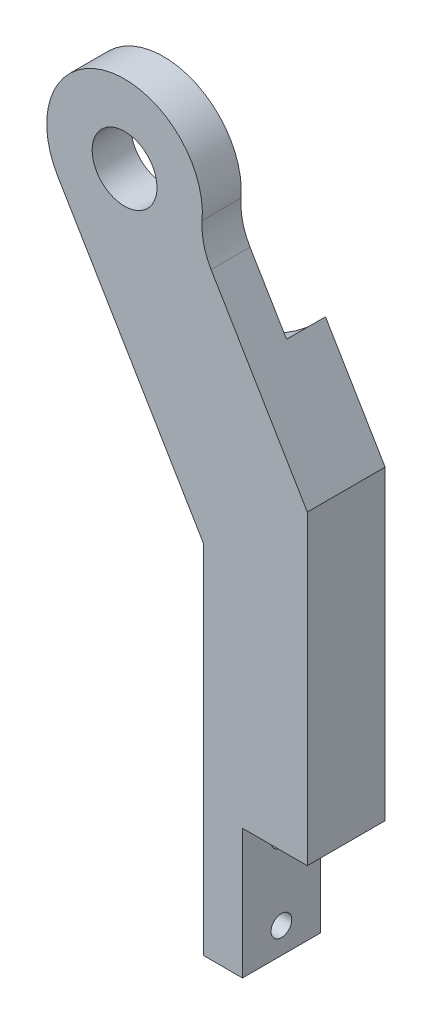
ISO-10303-21;
HEADER;
FILE_DESCRIPTION(('STEP AP214'),'2;1');
FILE_NAME('part.step','',(''),(''),'','','');
FILE_SCHEMA(('AUTOMOTIVE_DESIGN { 1 0 10303 214 1 1 1 1 }'));
ENDSEC;
DATA;
#1=APPLICATION_CONTEXT('core data for automotive mechanical design processes');
#2=APPLICATION_PROTOCOL_DEFINITION('international standard','automotive_design',2000,#1);
#3=PRODUCT_CONTEXT('',#1,'mechanical');
#4=PRODUCT('Part','Part','',(#3));
#5=PRODUCT_RELATED_PRODUCT_CATEGORY('part','',(#4));
#6=PRODUCT_DEFINITION_FORMATION('','',#4);
#7=PRODUCT_DEFINITION_CONTEXT('part definition',#1,'design');
#8=PRODUCT_DEFINITION('design','',#6,#7);
#9=PRODUCT_DEFINITION_SHAPE('','',#8);
#10=(LENGTH_UNIT() NAMED_UNIT(*) SI_UNIT(.MILLI.,.METRE.));
#11=(NAMED_UNIT(*) PLANE_ANGLE_UNIT() SI_UNIT($,.RADIAN.));
#12=(NAMED_UNIT(*) SI_UNIT($,.STERADIAN.) SOLID_ANGLE_UNIT());
#13=UNCERTAINTY_MEASURE_WITH_UNIT(LENGTH_MEASURE(1.E-05),#10,'distance_accuracy_value','');
#14=(GEOMETRIC_REPRESENTATION_CONTEXT(3) GLOBAL_UNCERTAINTY_ASSIGNED_CONTEXT((#13)) GLOBAL_UNIT_ASSIGNED_CONTEXT((#10,
#11,#12)) REPRESENTATION_CONTEXT('',''));
#15=CARTESIAN_POINT('',(0.,0.,0.));
#16=DIRECTION('',(0.,0.,1.));
#17=DIRECTION('',(1.,0.,0.));
#18=AXIS2_PLACEMENT_3D('',#15,#16,#17);
#19=CARTESIAN_POINT('',(28.18,-94.97,6.));
#20=DIRECTION('',(-1.,0.,0.));
#21=DIRECTION('',(0.,-1.,0.));
#22=AXIS2_PLACEMENT_3D('',#19,#20,#21);
#23=CYLINDRICAL_SURFACE('',#22,1.6);
#24=CARTESIAN_POINT('',(12.18,-94.97,6.));
#25=DIRECTION('',(-1.,0.,0.));
#26=DIRECTION('',(0.,-1.,0.));
#27=AXIS2_PLACEMENT_3D('',#24,#25,#26);
#28=CIRCLE('',#27,1.6);
#29=CARTESIAN_POINT('',(12.18,-96.57,6.));
#30=VERTEX_POINT('',#29);
#31=EDGE_CURVE('E98',#30,#30,#28,.T.);
#32=ORIENTED_EDGE('',*,*,#31,.T.);
#33=EDGE_LOOP('',(#32));
#34=FACE_BOUND('',#33,.T.);
#35=CARTESIAN_POINT('',(18.18,-94.97,6.));
#36=DIRECTION('',(-1.,0.,0.));
#37=DIRECTION('',(0.,-1.,0.));
#38=AXIS2_PLACEMENT_3D('',#35,#36,#37);
#39=CIRCLE('',#38,1.6);
#40=CARTESIAN_POINT('',(18.18,-96.57,6.));
#41=VERTEX_POINT('',#40);
#42=EDGE_CURVE('E122',#41,#41,#39,.F.);
#43=ORIENTED_EDGE('',*,*,#42,.T.);
#44=EDGE_LOOP('',(#43));
#45=FACE_BOUND('',#44,.T.);
#46=ADVANCED_FACE('F16',(#34,#45),#23,.F.);
#47=CARTESIAN_POINT('',(28.18,-82.97,6.));
#48=DIRECTION('',(-1.,0.,0.));
#49=DIRECTION('',(0.,-1.,0.));
#50=AXIS2_PLACEMENT_3D('',#47,#48,#49);
#51=CYLINDRICAL_SURFACE('',#50,1.6);
#52=CARTESIAN_POINT('',(12.18,-82.97,6.));
#53=DIRECTION('',(-1.,0.,0.));
#54=DIRECTION('',(0.,-1.,0.));
#55=AXIS2_PLACEMENT_3D('',#52,#53,#54);
#56=CIRCLE('',#55,1.6);
#57=CARTESIAN_POINT('',(12.18,-84.57,6.));
#58=VERTEX_POINT('',#57);
#59=EDGE_CURVE('E126',#58,#58,#56,.T.);
#60=ORIENTED_EDGE('',*,*,#59,.T.);
#61=EDGE_LOOP('',(#60));
#62=FACE_BOUND('',#61,.T.);
#63=CARTESIAN_POINT('',(18.18,-82.97,6.));
#64=DIRECTION('',(-1.,0.,0.));
#65=DIRECTION('',(0.,-1.,0.));
#66=AXIS2_PLACEMENT_3D('',#63,#64,#65);
#67=CIRCLE('',#66,1.6);
#68=CARTESIAN_POINT('',(18.18,-84.57,6.));
#69=VERTEX_POINT('',#68);
#70=EDGE_CURVE('E118',#69,#69,#67,.F.);
#71=ORIENTED_EDGE('',*,*,#70,.T.);
#72=EDGE_LOOP('',(#71));
#73=FACE_BOUND('',#72,.T.);
#74=ADVANCED_FACE('F281',(#62,#73),#51,.F.);
#75=CARTESIAN_POINT('',(0.,0.,6.));
#76=DIRECTION('',(0.,0.,-1.));
#77=DIRECTION('',(-1.,0.,0.));
#78=AXIS2_PLACEMENT_3D('',#75,#76,#77);
#79=CYLINDRICAL_SURFACE('',#78,25.);
#80=DIRECTION('',(0.,0.,1.));
#81=VECTOR('',#80,1.);
#82=CARTESIAN_POINT('',(18.9802829658312,-16.2711050189278,12.));
#83=LINE('',#82,#81);
#84=CARTESIAN_POINT('',(18.9802829658312,-16.2711050189278,6.));
#85=VERTEX_POINT('',#84);
#86=CARTESIAN_POINT('',(18.9802829658312,-16.2711050189278,0.));
#87=VERTEX_POINT('',#86);
#88=EDGE_CURVE('E75',#85,#87,#83,.F.);
#89=ORIENTED_EDGE('',*,*,#88,.T.);
#90=CARTESIAN_POINT('',(0.,0.,0.));
#91=DIRECTION('',(0.,0.,-1.));
#92=DIRECTION('',(-1.,0.,0.));
#93=AXIS2_PLACEMENT_3D('',#90,#91,#92);
#94=CIRCLE('',#93,25.);
#95=CARTESIAN_POINT('',(0.8927170530346,-24.9840560410679,0.));
#96=VERTEX_POINT('',#95);
#97=EDGE_CURVE('E19',#87,#96,#94,.T.);
#98=ORIENTED_EDGE('',*,*,#97,.T.);
#99=DIRECTION('',(0.,0.,1.));
#100=VECTOR('',#99,1.);
#101=CARTESIAN_POINT('',(0.8927170530346,-24.9840560410679,12.));
#102=LINE('',#101,#100);
#103=CARTESIAN_POINT('',(0.8927170530346,-24.9840560410679,6.));
#104=VERTEX_POINT('',#103);
#105=EDGE_CURVE('E72',#96,#104,#102,.T.);
#106=ORIENTED_EDGE('',*,*,#105,.T.);
#107=CARTESIAN_POINT('',(0.,0.,6.));
#108=DIRECTION('',(0.,0.,-1.));
#109=DIRECTION('',(-1.,0.,0.));
#110=AXIS2_PLACEMENT_3D('',#107,#108,#109);
#111=CIRCLE('',#110,25.);
#112=EDGE_CURVE('E104',#85,#104,#111,.T.);
#113=ORIENTED_EDGE('',*,*,#112,.F.);
#114=EDGE_LOOP('',(#89,#98,#106,#113));
#115=FACE_BOUND('',#114,.T.);
#116=ADVANCED_FACE('F70',(#115),#79,.F.);
#117=CARTESIAN_POINT('',(0.,0.,0.));
#118=DIRECTION('',(0.,0.,1.));
#119=DIRECTION('',(1.,0.,0.));
#120=AXIS2_PLACEMENT_3D('',#117,#118,#119);
#121=PLANE('',#120);
#122=ORIENTED_EDGE('',*,*,#97,.F.);
#123=DIRECTION('',(0.511019977560834,-0.859568835250398,0.));
#124=VECTOR('',#123,1.);
#125=CARTESIAN_POINT('',(28.18,-31.745627352553,0.));
#126=LINE('',#125,#124);
#127=CARTESIAN_POINT('',(28.18,-31.745627352553,0.));
#128=VERTEX_POINT('',#127);
#129=EDGE_CURVE('E117',#87,#128,#126,.T.);
#130=ORIENTED_EDGE('',*,*,#129,.T.);
#131=DIRECTION('',(0.,-1.,0.));
#132=VECTOR('',#131,1.);
#133=CARTESIAN_POINT('',(28.18,-78.97,0.));
#134=LINE('',#133,#132);
#135=CARTESIAN_POINT('',(28.18,-78.97,0.));
#136=VERTEX_POINT('',#135);
#137=EDGE_CURVE('E149',#128,#136,#134,.T.);
#138=ORIENTED_EDGE('',*,*,#137,.T.);
#139=DIRECTION('',(1.,0.,0.));
#140=VECTOR('',#139,1.);
#141=CARTESIAN_POINT('',(18.18,-78.97,0.));
#142=LINE('',#141,#140);
#143=CARTESIAN_POINT('',(18.18,-78.97,0.));
#144=VERTEX_POINT('',#143);
#145=EDGE_CURVE('E155',#136,#144,#142,.F.);
#146=ORIENTED_EDGE('',*,*,#145,.T.);
#147=DIRECTION('',(0.,1.,0.));
#148=VECTOR('',#147,1.);
#149=CARTESIAN_POINT('',(18.18,-98.97,0.));
#150=LINE('',#149,#148);
#151=CARTESIAN_POINT('',(18.18,-98.97,0.));
#152=VERTEX_POINT('',#151);
#153=EDGE_CURVE('E161',#144,#152,#150,.F.);
#154=ORIENTED_EDGE('',*,*,#153,.T.);
#155=DIRECTION('',(1.,0.,0.));
#156=VECTOR('',#155,1.);
#157=CARTESIAN_POINT('',(12.18,-98.97,0.));
#158=LINE('',#157,#156);
#159=CARTESIAN_POINT('',(12.18,-98.97,0.));
#160=VERTEX_POINT('',#159);
#161=EDGE_CURVE('E125',#152,#160,#158,.F.);
#162=ORIENTED_EDGE('',*,*,#161,.T.);
#163=DIRECTION('',(0.,1.,0.));
#164=VECTOR('',#163,1.);
#165=CARTESIAN_POINT('',(12.18,-43.97,0.));
#166=LINE('',#165,#164);
#167=CARTESIAN_POINT('',(12.18,-43.97,0.));
#168=VERTEX_POINT('',#167);
#169=EDGE_CURVE('E86',#160,#168,#166,.T.);
#170=ORIENTED_EDGE('',*,*,#169,.T.);
#171=DIRECTION('',(-0.511019977560833,0.859568835250398,0.));
#172=VECTOR('',#171,1.);
#173=CARTESIAN_POINT('',(-10.3148260230048,-6.13223973073,0.));
#174=LINE('',#173,#172);
#175=EDGE_CURVE('E82',#168,#96,#174,.T.);
#176=ORIENTED_EDGE('',*,*,#175,.T.);
#177=EDGE_LOOP('',(#122,#130,#138,#146,#154,#162,#170,#176));
#178=FACE_BOUND('',#177,.T.);
#179=ADVANCED_FACE('F83',(#178),#121,.F.);
#180=CARTESIAN_POINT('',(0.,0.,6.));
#181=DIRECTION('',(0.,0.,-1.));
#182=DIRECTION('',(-1.,0.,0.));
#183=AXIS2_PLACEMENT_3D('',#180,#181,#182);
#184=PLANE('',#183);
#185=DIRECTION('',(0.511019977560834,-0.859568835250398,0.));
#186=VECTOR('',#185,1.);
#187=CARTESIAN_POINT('',(28.18,-31.745627352553,6.));
#188=LINE('',#187,#186);
#189=CARTESIAN_POINT('',(13.3404989177647,-6.7846214798705,6.));
#190=VERTEX_POINT('',#189);
#191=EDGE_CURVE('E137',#190,#85,#188,.T.);
#192=ORIENTED_EDGE('',*,*,#191,.T.);
#193=ORIENTED_EDGE('',*,*,#112,.T.);
#194=DIRECTION('',(-0.511019977560833,0.859568835250398,0.));
#195=VECTOR('',#194,1.);
#196=CARTESIAN_POINT('',(-10.3148260230048,-6.13223973073,6.));
#197=LINE('',#196,#195);
#198=CARTESIAN_POINT('',(-10.3148260230048,-6.13223973073,6.));
#199=VERTEX_POINT('',#198);
#200=EDGE_CURVE('E96',#104,#199,#197,.T.);
#201=ORIENTED_EDGE('',*,*,#200,.T.);
#202=CARTESIAN_POINT('',(0.,0.,6.));
#203=DIRECTION('',(0.,0.,-1.));
#204=DIRECTION('',(-1.,0.,0.));
#205=AXIS2_PLACEMENT_3D('',#202,#203,#204);
#206=CIRCLE('',#205,12.);
#207=CARTESIAN_POINT('',(11.9651930565102,-0.91332092959754,6.));
#208=VERTEX_POINT('',#207);
#209=EDGE_CURVE('E132',#208,#199,#206,.F.);
#210=ORIENTED_EDGE('',*,*,#209,.F.);
#211=CARTESIAN_POINT('',(21.9361872702686,-1.67442170426216,6.));
#212=DIRECTION('',(0.,0.,-1.));
#213=DIRECTION('',(-1.,0.,0.));
#214=AXIS2_PLACEMENT_3D('',#211,#212,#213);
#215=CIRCLE('',#214,10.);
#216=EDGE_CURVE('E115',#208,#190,#215,.F.);
#217=ORIENTED_EDGE('',*,*,#216,.T.);
#218=EDGE_LOOP('',(#192,#193,#201,#210,#217));
#219=FACE_BOUND('',#218,.T.);
#220=CARTESIAN_POINT('',(0.,0.,6.));
#221=DIRECTION('',(0.,0.,-1.));
#222=DIRECTION('',(-1.,0.,0.));
#223=AXIS2_PLACEMENT_3D('',#220,#221,#222);
#224=CIRCLE('',#223,5.);
#225=CARTESIAN_POINT('',(-5.,0.,6.));
#226=VERTEX_POINT('',#225);
#227=EDGE_CURVE('E112',#226,#226,#224,.F.);
#228=ORIENTED_EDGE('',*,*,#227,.T.);
#229=EDGE_LOOP('',(#228));
#230=FACE_BOUND('',#229,.T.);
#231=ADVANCED_FACE('F135',(#219,#230),#184,.T.);
#232=CARTESIAN_POINT('',(0.,0.,12.));
#233=DIRECTION('',(0.,0.,-1.));
#234=DIRECTION('',(-1.,0.,0.));
#235=AXIS2_PLACEMENT_3D('',#232,#233,#234);
#236=CYLINDRICAL_SURFACE('',#235,12.);
#237=ORIENTED_EDGE('',*,*,#209,.T.);
#238=DIRECTION('',(0.,0.,1.));
#239=VECTOR('',#238,1.);
#240=CARTESIAN_POINT('',(-10.3148260230048,-6.13223973073,12.));
#241=LINE('',#240,#239);
#242=CARTESIAN_POINT('',(-10.3148260230048,-6.13223973073,12.));
#243=VERTEX_POINT('',#242);
#244=EDGE_CURVE('E90',#199,#243,#241,.T.);
#245=ORIENTED_EDGE('',*,*,#244,.T.);
#246=CARTESIAN_POINT('',(0.,0.,12.));
#247=DIRECTION('',(0.,0.,-1.));
#248=DIRECTION('',(-1.,0.,0.));
#249=AXIS2_PLACEMENT_3D('',#246,#247,#248);
#250=CIRCLE('',#249,12.);
#251=CARTESIAN_POINT('',(11.9651930565102,-0.91332092959754,12.));
#252=VERTEX_POINT('',#251);
#253=EDGE_CURVE('E109',#252,#243,#250,.F.);
#254=ORIENTED_EDGE('',*,*,#253,.F.);
#255=DIRECTION('',(0.,0.,-1.));
#256=VECTOR('',#255,1.);
#257=CARTESIAN_POINT('',(11.9651930565102,-0.913320929597541,12.));
#258=LINE('',#257,#256);
#259=EDGE_CURVE('E79',#252,#208,#258,.T.);
#260=ORIENTED_EDGE('',*,*,#259,.T.);
#261=EDGE_LOOP('',(#237,#245,#254,#260));
#262=FACE_BOUND('',#261,.T.);
#263=ADVANCED_FACE('F185',(#262),#236,.T.);
#264=CARTESIAN_POINT('',(-10.3148260230048,-6.13223973073,12.));
#265=DIRECTION('',(0.859568835250398,0.511019977560833,0.));
#266=DIRECTION('',(-0.511019977560833,0.859568835250398,0.));
#267=AXIS2_PLACEMENT_3D('',#264,#265,#266);
#268=PLANE('',#267);
#269=ORIENTED_EDGE('',*,*,#105,.F.);
#270=ORIENTED_EDGE('',*,*,#175,.F.);
#271=DIRECTION('',(0.,0.,-1.));
#272=VECTOR('',#271,1.);
#273=CARTESIAN_POINT('',(12.18,-43.97,12.));
#274=LINE('',#273,#272);
#275=CARTESIAN_POINT('',(12.18,-43.97,12.));
#276=VERTEX_POINT('',#275);
#277=EDGE_CURVE('E129',#168,#276,#274,.F.);
#278=ORIENTED_EDGE('',*,*,#277,.T.);
#279=DIRECTION('',(0.511019977560833,-0.859568835250398,0.));
#280=VECTOR('',#279,1.);
#281=CARTESIAN_POINT('',(-10.3148260230048,-6.13223973073,12.));
#282=LINE('',#281,#280);
#283=EDGE_CURVE('E111',#243,#276,#282,.T.);
#284=ORIENTED_EDGE('',*,*,#283,.F.);
#285=ORIENTED_EDGE('',*,*,#244,.F.);
#286=ORIENTED_EDGE('',*,*,#200,.F.);
#287=EDGE_LOOP('',(#269,#270,#278,#284,#285,#286));
#288=FACE_BOUND('',#287,.T.);
#289=ADVANCED_FACE('F93',(#288),#268,.F.);
#290=CARTESIAN_POINT('',(12.18,-43.97,12.));
#291=DIRECTION('',(1.,0.,0.));
#292=DIRECTION('',(0.,0.,-1.));
#293=AXIS2_PLACEMENT_3D('',#290,#291,#292);
#294=PLANE('',#293);
#295=DIRECTION('',(0.,0.,1.));
#296=VECTOR('',#295,1.);
#297=CARTESIAN_POINT('',(12.18,-98.97,12.));
#298=LINE('',#297,#296);
#299=CARTESIAN_POINT('',(12.18,-98.97,12.));
#300=VERTEX_POINT('',#299);
#301=EDGE_CURVE('E167',#160,#300,#298,.T.);
#302=ORIENTED_EDGE('',*,*,#301,.T.);
#303=DIRECTION('',(0.,1.,0.));
#304=VECTOR('',#303,1.);
#305=CARTESIAN_POINT('',(12.18,0.,12.));
#306=LINE('',#305,#304);
#307=EDGE_CURVE('E189',#276,#300,#306,.F.);
#308=ORIENTED_EDGE('',*,*,#307,.F.);
#309=ORIENTED_EDGE('',*,*,#277,.F.);
#310=ORIENTED_EDGE('',*,*,#169,.F.);
#311=EDGE_LOOP('',(#302,#308,#309,#310));
#312=FACE_BOUND('',#311,.T.);
#313=ORIENTED_EDGE('',*,*,#59,.F.);
#314=EDGE_LOOP('',(#313));
#315=FACE_BOUND('',#314,.T.);
#316=ORIENTED_EDGE('',*,*,#31,.F.);
#317=EDGE_LOOP('',(#316));
#318=FACE_BOUND('',#317,.T.);
#319=ADVANCED_FACE('F311',(#312,#315,#318),#294,.F.);
#320=CARTESIAN_POINT('',(12.18,-98.97,12.));
#321=DIRECTION('',(0.,1.,0.));
#322=DIRECTION('',(0.,0.,1.));
#323=AXIS2_PLACEMENT_3D('',#320,#321,#322);
#324=PLANE('',#323);
#325=DIRECTION('',(0.,0.,1.));
#326=VECTOR('',#325,1.);
#327=CARTESIAN_POINT('',(18.18,-98.97,12.));
#328=LINE('',#327,#326);
#329=CARTESIAN_POINT('',(18.18,-98.97,12.));
#330=VERTEX_POINT('',#329);
#331=EDGE_CURVE('E121',#152,#330,#328,.T.);
#332=ORIENTED_EDGE('',*,*,#331,.T.);
#333=DIRECTION('',(1.,0.,0.));
#334=VECTOR('',#333,1.);
#335=CARTESIAN_POINT('',(0.,-98.97,12.));
#336=LINE('',#335,#334);
#337=EDGE_CURVE('E191',#300,#330,#336,.T.);
#338=ORIENTED_EDGE('',*,*,#337,.F.);
#339=ORIENTED_EDGE('',*,*,#301,.F.);
#340=ORIENTED_EDGE('',*,*,#161,.F.);
#341=EDGE_LOOP('',(#332,#338,#339,#340));
#342=FACE_BOUND('',#341,.T.);
#343=ADVANCED_FACE('F243',(#342),#324,.F.);
#344=CARTESIAN_POINT('',(18.18,-98.97,12.));
#345=DIRECTION('',(-1.,0.,0.));
#346=DIRECTION('',(0.,0.,1.));
#347=AXIS2_PLACEMENT_3D('',#344,#345,#346);
#348=PLANE('',#347);
#349=DIRECTION('',(0.,0.,1.));
#350=VECTOR('',#349,1.);
#351=CARTESIAN_POINT('',(18.18,-78.97,12.));
#352=LINE('',#351,#350);
#353=CARTESIAN_POINT('',(18.18,-78.97,12.));
#354=VERTEX_POINT('',#353);
#355=EDGE_CURVE('E158',#144,#354,#352,.T.);
#356=ORIENTED_EDGE('',*,*,#355,.T.);
#357=DIRECTION('',(0.,1.,0.));
#358=VECTOR('',#357,1.);
#359=CARTESIAN_POINT('',(18.18,0.,12.));
#360=LINE('',#359,#358);
#361=EDGE_CURVE('E214',#330,#354,#360,.T.);
#362=ORIENTED_EDGE('',*,*,#361,.F.);
#363=ORIENTED_EDGE('',*,*,#331,.F.);
#364=ORIENTED_EDGE('',*,*,#153,.F.);
#365=EDGE_LOOP('',(#356,#362,#363,#364));
#366=FACE_BOUND('',#365,.T.);
#367=ORIENTED_EDGE('',*,*,#70,.F.);
#368=EDGE_LOOP('',(#367));
#369=FACE_BOUND('',#368,.T.);
#370=ORIENTED_EDGE('',*,*,#42,.F.);
#371=EDGE_LOOP('',(#370));
#372=FACE_BOUND('',#371,.T.);
#373=ADVANCED_FACE('F272',(#366,#369,#372),#348,.F.);
#374=CARTESIAN_POINT('',(18.18,-78.97,12.));
#375=DIRECTION('',(0.,1.,0.));
#376=DIRECTION('',(0.,0.,1.));
#377=AXIS2_PLACEMENT_3D('',#374,#375,#376);
#378=PLANE('',#377);
#379=DIRECTION('',(0.,0.,1.));
#380=VECTOR('',#379,1.);
#381=CARTESIAN_POINT('',(28.18,-78.97,12.));
#382=LINE('',#381,#380);
#383=CARTESIAN_POINT('',(28.18,-78.97,12.));
#384=VERTEX_POINT('',#383);
#385=EDGE_CURVE('E152',#136,#384,#382,.T.);
#386=ORIENTED_EDGE('',*,*,#385,.T.);
#387=DIRECTION('',(1.,0.,0.));
#388=VECTOR('',#387,1.);
#389=CARTESIAN_POINT('',(0.,-78.97,12.));
#390=LINE('',#389,#388);
#391=EDGE_CURVE('E205',#354,#384,#390,.T.);
#392=ORIENTED_EDGE('',*,*,#391,.F.);
#393=ORIENTED_EDGE('',*,*,#355,.F.);
#394=ORIENTED_EDGE('',*,*,#145,.F.);
#395=EDGE_LOOP('',(#386,#392,#393,#394));
#396=FACE_BOUND('',#395,.T.);
#397=ADVANCED_FACE('F271',(#396),#378,.F.);
#398=CARTESIAN_POINT('',(28.18,-78.97,12.));
#399=DIRECTION('',(-1.,0.,0.));
#400=DIRECTION('',(0.,-1.,0.));
#401=AXIS2_PLACEMENT_3D('',#398,#399,#400);
#402=PLANE('',#401);
#403=DIRECTION('',(0.,0.,1.));
#404=VECTOR('',#403,1.);
#405=CARTESIAN_POINT('',(28.18,-31.745627352553,12.));
#406=LINE('',#405,#404);
#407=CARTESIAN_POINT('',(28.18,-31.745627352553,12.));
#408=VERTEX_POINT('',#407);
#409=EDGE_CURVE('E139',#128,#408,#406,.T.);
#410=ORIENTED_EDGE('',*,*,#409,.T.);
#411=DIRECTION('',(0.,1.,0.));
#412=VECTOR('',#411,1.);
#413=CARTESIAN_POINT('',(28.18,0.,12.));
#414=LINE('',#413,#412);
#415=EDGE_CURVE('E202',#384,#408,#414,.T.);
#416=ORIENTED_EDGE('',*,*,#415,.F.);
#417=ORIENTED_EDGE('',*,*,#385,.F.);
#418=ORIENTED_EDGE('',*,*,#137,.F.);
#419=EDGE_LOOP('',(#410,#416,#417,#418));
#420=FACE_BOUND('',#419,.T.);
#421=ADVANCED_FACE('F265',(#420),#402,.F.);
#422=CARTESIAN_POINT('',(28.18,-31.745627352553,12.));
#423=DIRECTION('',(-0.859568835250398,-0.511019977560834,0.));
#424=DIRECTION('',(0.511019977560834,-0.859568835250398,0.));
#425=AXIS2_PLACEMENT_3D('',#422,#423,#424);
#426=PLANE('',#425);
#427=ORIENTED_EDGE('',*,*,#88,.F.);
#428=ORIENTED_EDGE('',*,*,#191,.F.);
#429=DIRECTION('',(0.,0.,-1.));
#430=VECTOR('',#429,1.);
#431=CARTESIAN_POINT('',(13.3404989177647,-6.7846214798705,12.));
#432=LINE('',#431,#430);
#433=CARTESIAN_POINT('',(13.3404989177647,-6.7846214798705,12.));
#434=VERTEX_POINT('',#433);
#435=EDGE_CURVE('E34',#190,#434,#432,.F.);
#436=ORIENTED_EDGE('',*,*,#435,.T.);
#437=DIRECTION('',(-0.511019977560834,0.859568835250397,0.));
#438=VECTOR('',#437,1.);
#439=CARTESIAN_POINT('',(28.18,-31.745627352553,12.));
#440=LINE('',#439,#438);
#441=EDGE_CURVE('E108',#408,#434,#440,.T.);
#442=ORIENTED_EDGE('',*,*,#441,.F.);
#443=ORIENTED_EDGE('',*,*,#409,.F.);
#444=ORIENTED_EDGE('',*,*,#129,.F.);
#445=EDGE_LOOP('',(#427,#428,#436,#442,#443,#444));
#446=FACE_BOUND('',#445,.T.);
#447=ADVANCED_FACE('F141',(#446),#426,.F.);
#448=CARTESIAN_POINT('',(21.9361872702686,-1.67442170426216,12.));
#449=DIRECTION('',(0.,0.,-1.));
#450=DIRECTION('',(-1.,0.,0.));
#451=AXIS2_PLACEMENT_3D('',#448,#449,#450);
#452=CYLINDRICAL_SURFACE('',#451,10.);
#453=CARTESIAN_POINT('',(21.9361872702686,-1.67442170426216,12.));
#454=DIRECTION('',(0.,0.,-1.));
#455=DIRECTION('',(-1.,0.,0.));
#456=AXIS2_PLACEMENT_3D('',#453,#454,#455);
#457=CIRCLE('',#456,10.);
#458=EDGE_CURVE('E25',#434,#252,#457,.T.);
#459=ORIENTED_EDGE('',*,*,#458,.F.);
#460=ORIENTED_EDGE('',*,*,#435,.F.);
#461=ORIENTED_EDGE('',*,*,#216,.F.);
#462=ORIENTED_EDGE('',*,*,#259,.F.);
#463=EDGE_LOOP('',(#459,#460,#461,#462));
#464=FACE_BOUND('',#463,.T.);
#465=ADVANCED_FACE('F296',(#464),#452,.F.);
#466=CARTESIAN_POINT('',(0.,0.,12.));
#467=DIRECTION('',(0.,0.,-1.));
#468=DIRECTION('',(-1.,0.,0.));
#469=AXIS2_PLACEMENT_3D('',#466,#467,#468);
#470=CYLINDRICAL_SURFACE('',#469,5.);
#471=CARTESIAN_POINT('',(0.,0.,12.));
#472=DIRECTION('',(0.,0.,-1.));
#473=DIRECTION('',(-1.,0.,0.));
#474=AXIS2_PLACEMENT_3D('',#471,#472,#473);
#475=CIRCLE('',#474,5.);
#476=CARTESIAN_POINT('',(-5.,0.,12.));
#477=VERTEX_POINT('',#476);
#478=EDGE_CURVE('E11',#477,#477,#475,.T.);
#479=ORIENTED_EDGE('',*,*,#478,.F.);
#480=EDGE_LOOP('',(#479));
#481=FACE_BOUND('',#480,.T.);
#482=ORIENTED_EDGE('',*,*,#227,.F.);
#483=EDGE_LOOP('',(#482));
#484=FACE_BOUND('',#483,.T.);
#485=ADVANCED_FACE('F289',(#481,#484),#470,.F.);
#486=CARTESIAN_POINT('',(0.,0.,12.));
#487=DIRECTION('',(0.,0.,1.));
#488=DIRECTION('',(1.,0.,0.));
#489=AXIS2_PLACEMENT_3D('',#486,#487,#488);
#490=PLANE('',#489);
#491=ORIENTED_EDGE('',*,*,#478,.T.);
#492=EDGE_LOOP('',(#491));
#493=FACE_BOUND('',#492,.T.);
#494=ORIENTED_EDGE('',*,*,#458,.T.);
#495=ORIENTED_EDGE('',*,*,#253,.T.);
#496=ORIENTED_EDGE('',*,*,#283,.T.);
#497=ORIENTED_EDGE('',*,*,#307,.T.);
#498=ORIENTED_EDGE('',*,*,#337,.T.);
#499=ORIENTED_EDGE('',*,*,#361,.T.);
#500=ORIENTED_EDGE('',*,*,#391,.T.);
#501=ORIENTED_EDGE('',*,*,#415,.T.);
#502=ORIENTED_EDGE('',*,*,#441,.T.);
#503=EDGE_LOOP('',(#494,#495,#496,#497,#498,#499,#500,#501,#502));
#504=FACE_BOUND('',#503,.T.);
#505=ADVANCED_FACE('F236',(#493,#504),#490,.T.);
#506=CLOSED_SHELL('',(#46,#74,#116,#179,#231,#263,#289,#319,#343,#373,#397,#421,#447,#465,#485,#505));
#507=MANIFOLD_SOLID_BREP('B1',#506);
#508=ADVANCED_BREP_SHAPE_REPRESENTATION('',(#18,#507),#14);
#509=SHAPE_DEFINITION_REPRESENTATION(#9,#508);
ENDSEC;
END-ISO-10303-21;
